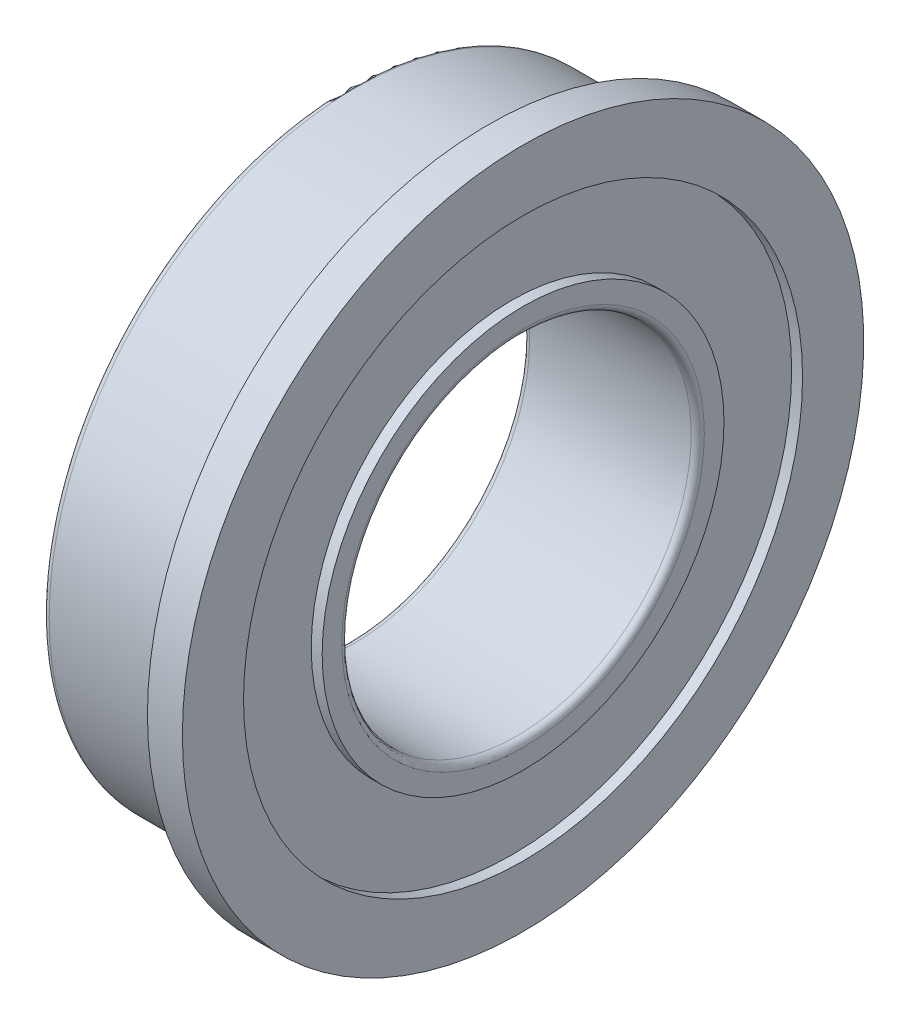
ISO-10303-21;
HEADER;
FILE_DESCRIPTION(('STEP AP214'),'2;1');
FILE_NAME('part.step','',(''),(''),'','','');
FILE_SCHEMA(('AUTOMOTIVE_DESIGN { 1 0 10303 214 1 1 1 1 }'));
ENDSEC;
DATA;
#1=APPLICATION_CONTEXT('core data for automotive mechanical design processes');
#2=APPLICATION_PROTOCOL_DEFINITION('international standard','automotive_design',2000,#1);
#3=PRODUCT_CONTEXT('',#1,'mechanical');
#4=PRODUCT('Part','Part','',(#3));
#5=PRODUCT_RELATED_PRODUCT_CATEGORY('part','',(#4));
#6=PRODUCT_DEFINITION_FORMATION('','',#4);
#7=PRODUCT_DEFINITION_CONTEXT('part definition',#1,'design');
#8=PRODUCT_DEFINITION('design','',#6,#7);
#9=PRODUCT_DEFINITION_SHAPE('','',#8);
#10=(LENGTH_UNIT() NAMED_UNIT(*) SI_UNIT(.MILLI.,.METRE.));
#11=(NAMED_UNIT(*) PLANE_ANGLE_UNIT() SI_UNIT($,.RADIAN.));
#12=(NAMED_UNIT(*) SI_UNIT($,.STERADIAN.) SOLID_ANGLE_UNIT());
#13=UNCERTAINTY_MEASURE_WITH_UNIT(LENGTH_MEASURE(1.E-05),#10,'distance_accuracy_value','');
#14=(GEOMETRIC_REPRESENTATION_CONTEXT(3) GLOBAL_UNCERTAINTY_ASSIGNED_CONTEXT((#13)) GLOBAL_UNIT_ASSIGNED_CONTEXT((#10,
#11,#12)) REPRESENTATION_CONTEXT('',''));
#15=CARTESIAN_POINT('',(0.,0.,0.));
#16=DIRECTION('',(0.,0.,1.));
#17=DIRECTION('',(1.,0.,0.));
#18=AXIS2_PLACEMENT_3D('',#15,#16,#17);
#19=CARTESIAN_POINT('',(-3.2,0.,0.));
#20=DIRECTION('',(-1.,0.,0.));
#21=DIRECTION('',(0.,0.,1.));
#22=AXIS2_PLACEMENT_3D('',#19,#20,#21);
#23=CYLINDRICAL_SURFACE('',#22,7.8);
#24=CARTESIAN_POINT('',(0.,0.,0.));
#25=DIRECTION('',(-1.,0.,0.));
#26=DIRECTION('',(0.,0.,1.));
#27=AXIS2_PLACEMENT_3D('',#24,#25,#26);
#28=CIRCLE('',#27,7.8);
#29=CARTESIAN_POINT('',(0.,0.,7.8));
#30=VERTEX_POINT('',#29);
#31=EDGE_CURVE('E60',#30,#30,#28,.T.);
#32=ORIENTED_EDGE('',*,*,#31,.F.);
#33=EDGE_LOOP('',(#32));
#34=FACE_BOUND('',#33,.T.);
#35=CARTESIAN_POINT('',(0.8,0.,0.));
#36=DIRECTION('',(-1.,0.,0.));
#37=DIRECTION('',(0.,0.,1.));
#38=AXIS2_PLACEMENT_3D('',#35,#36,#37);
#39=CIRCLE('',#38,7.8);
#40=CARTESIAN_POINT('',(0.8,0.,7.8));
#41=VERTEX_POINT('',#40);
#42=EDGE_CURVE('E93',#41,#41,#39,.T.);
#43=ORIENTED_EDGE('',*,*,#42,.T.);
#44=EDGE_LOOP('',(#43));
#45=FACE_BOUND('',#44,.T.);
#46=ADVANCED_FACE('F34',(#34,#45),#23,.T.);
#47=CARTESIAN_POINT('',(0.,7.2,0.));
#48=DIRECTION('',(1.,0.,0.));
#49=DIRECTION('',(0.,0.,-1.));
#50=AXIS2_PLACEMENT_3D('',#47,#48,#49);
#51=PLANE('',#50);
#52=CARTESIAN_POINT('',(0.,0.,0.));
#53=DIRECTION('',(-1.,0.,0.));
#54=DIRECTION('',(0.,0.,1.));
#55=AXIS2_PLACEMENT_3D('',#52,#53,#54);
#56=CIRCLE('',#55,7.2);
#57=CARTESIAN_POINT('',(0.,0.,7.2));
#58=VERTEX_POINT('',#57);
#59=EDGE_CURVE('E63',#58,#58,#56,.T.);
#60=ORIENTED_EDGE('',*,*,#59,.F.);
#61=EDGE_LOOP('',(#60));
#62=FACE_BOUND('',#61,.T.);
#63=ORIENTED_EDGE('',*,*,#31,.T.);
#64=EDGE_LOOP('',(#63));
#65=FACE_BOUND('',#64,.T.);
#66=ADVANCED_FACE('F135',(#62,#65),#51,.F.);
#67=CARTESIAN_POINT('',(0.,0.,0.));
#68=DIRECTION('',(-1.,0.,0.));
#69=DIRECTION('',(0.,0.,1.));
#70=AXIS2_PLACEMENT_3D('',#67,#68,#69);
#71=TOROIDAL_SURFACE('',#70,7.,0.2);
#72=CARTESIAN_POINT('',(-0.2,0.,0.));
#73=DIRECTION('',(-1.,0.,0.));
#74=DIRECTION('',(0.,0.,1.));
#75=AXIS2_PLACEMENT_3D('',#72,#73,#74);
#76=CIRCLE('',#75,7.);
#77=CARTESIAN_POINT('',(-0.2,0.,7.));
#78=VERTEX_POINT('',#77);
#79=EDGE_CURVE('E66',#78,#78,#76,.T.);
#80=ORIENTED_EDGE('',*,*,#79,.F.);
#81=EDGE_LOOP('',(#80));
#82=FACE_BOUND('',#81,.T.);
#83=ORIENTED_EDGE('',*,*,#59,.T.);
#84=EDGE_LOOP('',(#83));
#85=FACE_BOUND('',#84,.T.);
#86=ADVANCED_FACE('F141',(#82,#85),#71,.F.);
#87=CARTESIAN_POINT('',(-3.2,0.,0.));
#88=DIRECTION('',(-1.,0.,0.));
#89=DIRECTION('',(0.,0.,1.));
#90=AXIS2_PLACEMENT_3D('',#87,#88,#89);
#91=CYLINDRICAL_SURFACE('',#90,7.);
#92=CARTESIAN_POINT('',(-3.05,0.,0.));
#93=DIRECTION('',(1.,0.,0.));
#94=DIRECTION('',(0.,0.,-1.));
#95=AXIS2_PLACEMENT_3D('',#92,#93,#94);
#96=CIRCLE('',#95,7.);
#97=CARTESIAN_POINT('',(-3.05,0.,-7.));
#98=VERTEX_POINT('',#97);
#99=EDGE_CURVE('E10',#98,#98,#96,.T.);
#100=ORIENTED_EDGE('',*,*,#99,.T.);
#101=EDGE_LOOP('',(#100));
#102=FACE_BOUND('',#101,.T.);
#103=ORIENTED_EDGE('',*,*,#79,.T.);
#104=EDGE_LOOP('',(#103));
#105=FACE_BOUND('',#104,.T.);
#106=ADVANCED_FACE('F186',(#102,#105),#91,.T.);
#107=CARTESIAN_POINT('',(-3.2,6.4,0.));
#108=DIRECTION('',(1.,0.,0.));
#109=DIRECTION('',(0.,0.,-1.));
#110=AXIS2_PLACEMENT_3D('',#107,#108,#109);
#111=PLANE('',#110);
#112=CARTESIAN_POINT('',(-3.2,0.,0.));
#113=DIRECTION('',(1.,0.,0.));
#114=DIRECTION('',(0.,0.,-1.));
#115=AXIS2_PLACEMENT_3D('',#112,#113,#114);
#116=CIRCLE('',#115,6.85);
#117=CARTESIAN_POINT('',(-3.2,0.,-6.85));
#118=VERTEX_POINT('',#117);
#119=EDGE_CURVE('E41',#118,#118,#116,.F.);
#120=ORIENTED_EDGE('',*,*,#119,.T.);
#121=EDGE_LOOP('',(#120));
#122=FACE_BOUND('',#121,.T.);
#123=CARTESIAN_POINT('',(-3.2,0.,0.));
#124=DIRECTION('',(-1.,0.,0.));
#125=DIRECTION('',(0.,0.,1.));
#126=AXIS2_PLACEMENT_3D('',#123,#124,#125);
#127=CIRCLE('',#126,6.4);
#128=CARTESIAN_POINT('',(-3.2,0.,6.4));
#129=VERTEX_POINT('',#128);
#130=EDGE_CURVE('E69',#129,#129,#127,.T.);
#131=ORIENTED_EDGE('',*,*,#130,.F.);
#132=EDGE_LOOP('',(#131));
#133=FACE_BOUND('',#132,.T.);
#134=ADVANCED_FACE('F181',(#122,#133),#111,.F.);
#135=CARTESIAN_POINT('',(-3.2,0.,0.));
#136=DIRECTION('',(-1.,0.,0.));
#137=DIRECTION('',(0.,0.,1.));
#138=AXIS2_PLACEMENT_3D('',#135,#136,#137);
#139=CYLINDRICAL_SURFACE('',#138,6.4);
#140=CARTESIAN_POINT('',(-2.95,0.,0.));
#141=DIRECTION('',(-1.,0.,0.));
#142=DIRECTION('',(0.,0.,1.));
#143=AXIS2_PLACEMENT_3D('',#140,#141,#142);
#144=CIRCLE('',#143,6.4);
#145=CARTESIAN_POINT('',(-2.95,0.,6.4));
#146=VERTEX_POINT('',#145);
#147=EDGE_CURVE('E72',#146,#146,#144,.T.);
#148=ORIENTED_EDGE('',*,*,#147,.F.);
#149=EDGE_LOOP('',(#148));
#150=FACE_BOUND('',#149,.T.);
#151=ORIENTED_EDGE('',*,*,#130,.T.);
#152=EDGE_LOOP('',(#151));
#153=FACE_BOUND('',#152,.T.);
#154=ADVANCED_FACE('F175',(#150,#153),#139,.F.);
#155=CARTESIAN_POINT('',(-2.95,6.4,0.));
#156=DIRECTION('',(1.,0.,0.));
#157=DIRECTION('',(0.,0.,-1.));
#158=AXIS2_PLACEMENT_3D('',#155,#156,#157);
#159=PLANE('',#158);
#160=CARTESIAN_POINT('',(-2.95,0.,0.));
#161=DIRECTION('',(-1.,0.,0.));
#162=DIRECTION('',(0.,0.,1.));
#163=AXIS2_PLACEMENT_3D('',#160,#161,#162);
#164=CIRCLE('',#163,4.6);
#165=CARTESIAN_POINT('',(-2.95,0.,4.6));
#166=VERTEX_POINT('',#165);
#167=EDGE_CURVE('E75',#166,#166,#164,.T.);
#168=ORIENTED_EDGE('',*,*,#167,.F.);
#169=EDGE_LOOP('',(#168));
#170=FACE_BOUND('',#169,.T.);
#171=ORIENTED_EDGE('',*,*,#147,.T.);
#172=EDGE_LOOP('',(#171));
#173=FACE_BOUND('',#172,.T.);
#174=ADVANCED_FACE('F169',(#170,#173),#159,.F.);
#175=CARTESIAN_POINT('',(-3.2,0.,0.));
#176=DIRECTION('',(-1.,0.,0.));
#177=DIRECTION('',(0.,0.,1.));
#178=AXIS2_PLACEMENT_3D('',#175,#176,#177);
#179=CYLINDRICAL_SURFACE('',#178,4.6);
#180=CARTESIAN_POINT('',(-3.2,0.,0.));
#181=DIRECTION('',(-1.,0.,0.));
#182=DIRECTION('',(0.,0.,1.));
#183=AXIS2_PLACEMENT_3D('',#180,#181,#182);
#184=CIRCLE('',#183,4.6);
#185=CARTESIAN_POINT('',(-3.2,0.,4.6));
#186=VERTEX_POINT('',#185);
#187=EDGE_CURVE('E78',#186,#186,#184,.T.);
#188=ORIENTED_EDGE('',*,*,#187,.F.);
#189=EDGE_LOOP('',(#188));
#190=FACE_BOUND('',#189,.T.);
#191=ORIENTED_EDGE('',*,*,#167,.T.);
#192=EDGE_LOOP('',(#191));
#193=FACE_BOUND('',#192,.T.);
#194=ADVANCED_FACE('F163',(#190,#193),#179,.T.);
#195=CARTESIAN_POINT('',(-3.2,4.,0.));
#196=DIRECTION('',(1.,0.,0.));
#197=DIRECTION('',(0.,0.,-1.));
#198=AXIS2_PLACEMENT_3D('',#195,#196,#197);
#199=PLANE('',#198);
#200=CARTESIAN_POINT('',(-3.2,0.,0.));
#201=DIRECTION('',(1.,0.,0.));
#202=DIRECTION('',(0.,0.,-1.));
#203=AXIS2_PLACEMENT_3D('',#200,#201,#202);
#204=CIRCLE('',#203,4.15);
#205=CARTESIAN_POINT('',(-3.2,0.,-4.15));
#206=VERTEX_POINT('',#205);
#207=EDGE_CURVE('E45',#206,#206,#204,.T.);
#208=ORIENTED_EDGE('',*,*,#207,.T.);
#209=EDGE_LOOP('',(#208));
#210=FACE_BOUND('',#209,.T.);
#211=ORIENTED_EDGE('',*,*,#187,.T.);
#212=EDGE_LOOP('',(#211));
#213=FACE_BOUND('',#212,.T.);
#214=ADVANCED_FACE('F131',(#210,#213),#199,.F.);
#215=CARTESIAN_POINT('',(-3.2,0.,0.));
#216=DIRECTION('',(-1.,0.,0.));
#217=DIRECTION('',(0.,0.,1.));
#218=AXIS2_PLACEMENT_3D('',#215,#216,#217);
#219=CYLINDRICAL_SURFACE('',#218,4.);
#220=CARTESIAN_POINT('',(0.65,0.,0.));
#221=DIRECTION('',(-1.,0.,0.));
#222=DIRECTION('',(0.,0.,1.));
#223=AXIS2_PLACEMENT_3D('',#220,#221,#222);
#224=CIRCLE('',#223,4.);
#225=CARTESIAN_POINT('',(0.65,0.,4.));
#226=VERTEX_POINT('',#225);
#227=EDGE_CURVE('E49',#226,#226,#224,.F.);
#228=ORIENTED_EDGE('',*,*,#227,.T.);
#229=EDGE_LOOP('',(#228));
#230=FACE_BOUND('',#229,.T.);
#231=CARTESIAN_POINT('',(-3.05,0.,0.));
#232=DIRECTION('',(1.,0.,0.));
#233=DIRECTION('',(0.,0.,-1.));
#234=AXIS2_PLACEMENT_3D('',#231,#232,#233);
#235=CIRCLE('',#234,4.);
#236=CARTESIAN_POINT('',(-3.05,0.,-4.));
#237=VERTEX_POINT('',#236);
#238=EDGE_CURVE('E54',#237,#237,#235,.F.);
#239=ORIENTED_EDGE('',*,*,#238,.T.);
#240=EDGE_LOOP('',(#239));
#241=FACE_BOUND('',#240,.T.);
#242=ADVANCED_FACE('F125',(#230,#241),#219,.F.);
#243=CARTESIAN_POINT('',(0.8,4.6,0.));
#244=DIRECTION('',(-1.,0.,0.));
#245=DIRECTION('',(0.,0.,1.));
#246=AXIS2_PLACEMENT_3D('',#243,#244,#245);
#247=PLANE('',#246);
#248=CARTESIAN_POINT('',(0.8,0.,0.));
#249=DIRECTION('',(-1.,0.,0.));
#250=DIRECTION('',(0.,0.,1.));
#251=AXIS2_PLACEMENT_3D('',#248,#249,#250);
#252=CIRCLE('',#251,4.15);
#253=CARTESIAN_POINT('',(0.8,0.,4.15));
#254=VERTEX_POINT('',#253);
#255=EDGE_CURVE('E57',#254,#254,#252,.T.);
#256=ORIENTED_EDGE('',*,*,#255,.T.);
#257=EDGE_LOOP('',(#256));
#258=FACE_BOUND('',#257,.T.);
#259=CARTESIAN_POINT('',(0.8,0.,0.));
#260=DIRECTION('',(-1.,0.,0.));
#261=DIRECTION('',(0.,0.,1.));
#262=AXIS2_PLACEMENT_3D('',#259,#260,#261);
#263=CIRCLE('',#262,4.6);
#264=CARTESIAN_POINT('',(0.8,0.,4.6));
#265=VERTEX_POINT('',#264);
#266=EDGE_CURVE('E81',#265,#265,#263,.T.);
#267=ORIENTED_EDGE('',*,*,#266,.F.);
#268=EDGE_LOOP('',(#267));
#269=FACE_BOUND('',#268,.T.);
#270=ADVANCED_FACE('F120',(#258,#269),#247,.F.);
#271=CARTESIAN_POINT('',(-3.2,0.,0.));
#272=DIRECTION('',(-1.,0.,0.));
#273=DIRECTION('',(0.,0.,1.));
#274=AXIS2_PLACEMENT_3D('',#271,#272,#273);
#275=CYLINDRICAL_SURFACE('',#274,4.6);
#276=CARTESIAN_POINT('',(0.549999999999999,0.,0.));
#277=DIRECTION('',(-1.,0.,0.));
#278=DIRECTION('',(0.,0.,1.));
#279=AXIS2_PLACEMENT_3D('',#276,#277,#278);
#280=CIRCLE('',#279,4.6);
#281=CARTESIAN_POINT('',(0.549999999999999,0.,4.6));
#282=VERTEX_POINT('',#281);
#283=EDGE_CURVE('E84',#282,#282,#280,.T.);
#284=ORIENTED_EDGE('',*,*,#283,.F.);
#285=EDGE_LOOP('',(#284));
#286=FACE_BOUND('',#285,.T.);
#287=ORIENTED_EDGE('',*,*,#266,.T.);
#288=EDGE_LOOP('',(#287));
#289=FACE_BOUND('',#288,.T.);
#290=ADVANCED_FACE('F114',(#286,#289),#275,.T.);
#291=CARTESIAN_POINT('',(0.549999999999999,6.4,0.));
#292=DIRECTION('',(-1.,0.,0.));
#293=DIRECTION('',(0.,0.,1.));
#294=AXIS2_PLACEMENT_3D('',#291,#292,#293);
#295=PLANE('',#294);
#296=CARTESIAN_POINT('',(0.549999999999999,0.,0.));
#297=DIRECTION('',(-1.,0.,0.));
#298=DIRECTION('',(0.,0.,1.));
#299=AXIS2_PLACEMENT_3D('',#296,#297,#298);
#300=CIRCLE('',#299,6.4);
#301=CARTESIAN_POINT('',(0.549999999999999,0.,6.4));
#302=VERTEX_POINT('',#301);
#303=EDGE_CURVE('E87',#302,#302,#300,.T.);
#304=ORIENTED_EDGE('',*,*,#303,.F.);
#305=EDGE_LOOP('',(#304));
#306=FACE_BOUND('',#305,.T.);
#307=ORIENTED_EDGE('',*,*,#283,.T.);
#308=EDGE_LOOP('',(#307));
#309=FACE_BOUND('',#308,.T.);
#310=ADVANCED_FACE('F108',(#306,#309),#295,.F.);
#311=CARTESIAN_POINT('',(-3.2,0.,0.));
#312=DIRECTION('',(-1.,0.,0.));
#313=DIRECTION('',(0.,0.,1.));
#314=AXIS2_PLACEMENT_3D('',#311,#312,#313);
#315=CYLINDRICAL_SURFACE('',#314,6.4);
#316=CARTESIAN_POINT('',(0.8,0.,0.));
#317=DIRECTION('',(-1.,0.,0.));
#318=DIRECTION('',(0.,0.,1.));
#319=AXIS2_PLACEMENT_3D('',#316,#317,#318);
#320=CIRCLE('',#319,6.4);
#321=CARTESIAN_POINT('',(0.8,0.,6.4));
#322=VERTEX_POINT('',#321);
#323=EDGE_CURVE('E90',#322,#322,#320,.T.);
#324=ORIENTED_EDGE('',*,*,#323,.F.);
#325=EDGE_LOOP('',(#324));
#326=FACE_BOUND('',#325,.T.);
#327=ORIENTED_EDGE('',*,*,#303,.T.);
#328=EDGE_LOOP('',(#327));
#329=FACE_BOUND('',#328,.T.);
#330=ADVANCED_FACE('F102',(#326,#329),#315,.F.);
#331=CARTESIAN_POINT('',(0.8,7.8,0.));
#332=DIRECTION('',(-1.,0.,0.));
#333=DIRECTION('',(0.,0.,1.));
#334=AXIS2_PLACEMENT_3D('',#331,#332,#333);
#335=PLANE('',#334);
#336=ORIENTED_EDGE('',*,*,#42,.F.);
#337=EDGE_LOOP('',(#336));
#338=FACE_BOUND('',#337,.T.);
#339=ORIENTED_EDGE('',*,*,#323,.T.);
#340=EDGE_LOOP('',(#339));
#341=FACE_BOUND('',#340,.T.);
#342=ADVANCED_FACE('F98',(#338,#341),#335,.F.);
#343=CARTESIAN_POINT('',(0.65,0.,0.));
#344=DIRECTION('',(-1.,0.,0.));
#345=DIRECTION('',(0.,0.,1.));
#346=AXIS2_PLACEMENT_3D('',#343,#344,#345);
#347=TOROIDAL_SURFACE('',#346,4.15,0.15);
#348=ORIENTED_EDGE('',*,*,#227,.F.);
#349=EDGE_LOOP('',(#348));
#350=FACE_BOUND('',#349,.T.);
#351=ORIENTED_EDGE('',*,*,#255,.F.);
#352=EDGE_LOOP('',(#351));
#353=FACE_BOUND('',#352,.T.);
#354=ADVANCED_FACE('F101',(#350,#353),#347,.T.);
#355=CARTESIAN_POINT('',(-3.05,0.,0.));
#356=DIRECTION('',(1.,0.,0.));
#357=DIRECTION('',(0.,0.,-1.));
#358=AXIS2_PLACEMENT_3D('',#355,#356,#357);
#359=TOROIDAL_SURFACE('',#358,4.15,0.15);
#360=ORIENTED_EDGE('',*,*,#207,.F.);
#361=EDGE_LOOP('',(#360));
#362=FACE_BOUND('',#361,.T.);
#363=ORIENTED_EDGE('',*,*,#238,.F.);
#364=EDGE_LOOP('',(#363));
#365=FACE_BOUND('',#364,.T.);
#366=ADVANCED_FACE('F148',(#362,#365),#359,.T.);
#367=CARTESIAN_POINT('',(-3.05,0.,0.));
#368=DIRECTION('',(1.,0.,0.));
#369=DIRECTION('',(0.,0.,-1.));
#370=AXIS2_PLACEMENT_3D('',#367,#368,#369);
#371=TOROIDAL_SURFACE('',#370,6.85,0.15);
#372=ORIENTED_EDGE('',*,*,#99,.F.);
#373=EDGE_LOOP('',(#372));
#374=FACE_BOUND('',#373,.T.);
#375=ORIENTED_EDGE('',*,*,#119,.F.);
#376=EDGE_LOOP('',(#375));
#377=FACE_BOUND('',#376,.T.);
#378=ADVANCED_FACE('F36',(#374,#377),#371,.T.);
#379=CLOSED_SHELL('',(#46,#66,#86,#106,#134,#154,#174,#194,#214,#242,#270,#290,#310,#330,#342,
#354,#366,#378));
#380=MANIFOLD_SOLID_BREP('B2',#379);
#381=ADVANCED_BREP_SHAPE_REPRESENTATION('',(#18,#380),#14);
#382=SHAPE_DEFINITION_REPRESENTATION(#9,#381);
ENDSEC;
END-ISO-10303-21;
